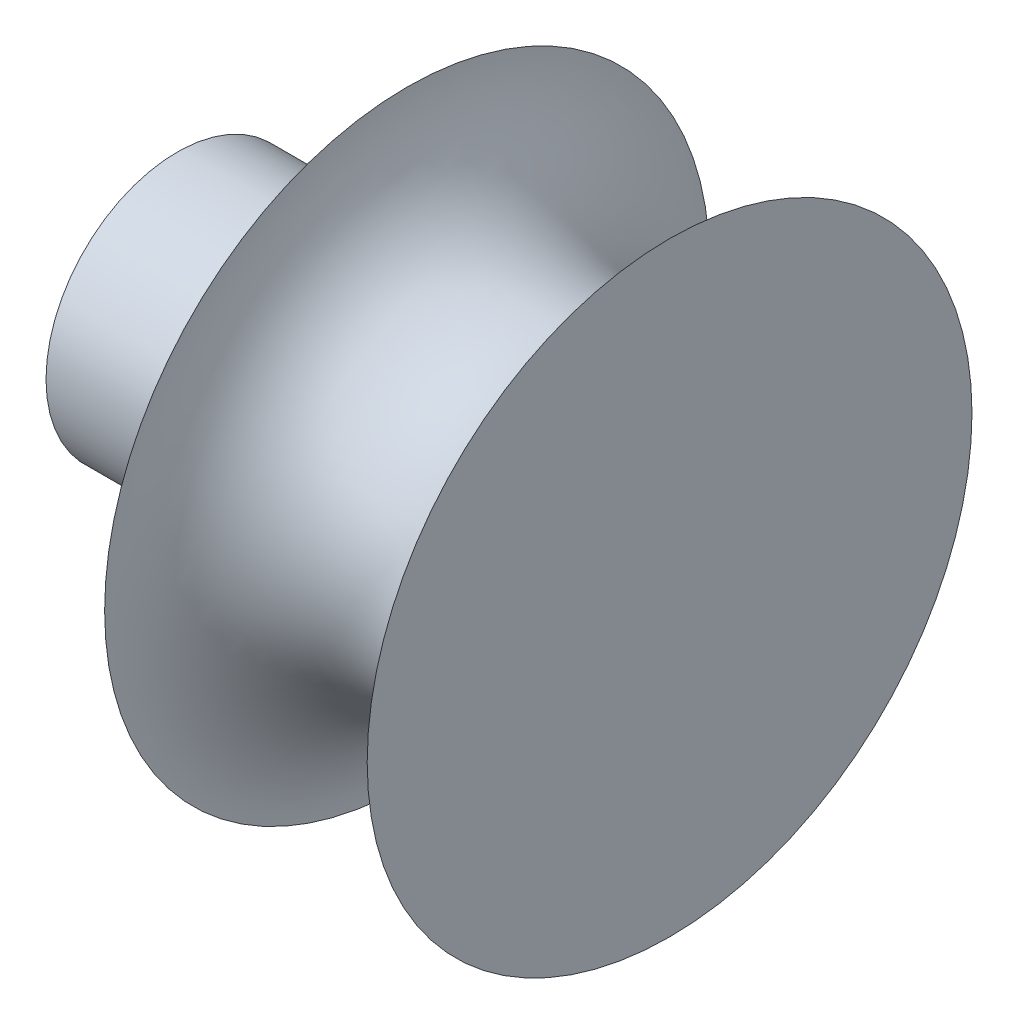
ISO-10303-21;
HEADER;
FILE_DESCRIPTION(('STEP AP214'),'2;1');
FILE_NAME('part.step','',(''),(''),'','','');
FILE_SCHEMA(('AUTOMOTIVE_DESIGN { 1 0 10303 214 1 1 1 1 }'));
ENDSEC;
DATA;
#1=APPLICATION_CONTEXT('core data for automotive mechanical design processes');
#2=APPLICATION_PROTOCOL_DEFINITION('international standard','automotive_design',2000,#1);
#3=PRODUCT_CONTEXT('',#1,'mechanical');
#4=PRODUCT('Part','Part','',(#3));
#5=PRODUCT_RELATED_PRODUCT_CATEGORY('part','',(#4));
#6=PRODUCT_DEFINITION_FORMATION('','',#4);
#7=PRODUCT_DEFINITION_CONTEXT('part definition',#1,'design');
#8=PRODUCT_DEFINITION('design','',#6,#7);
#9=PRODUCT_DEFINITION_SHAPE('','',#8);
#10=(LENGTH_UNIT() NAMED_UNIT(*) SI_UNIT(.MILLI.,.METRE.));
#11=(NAMED_UNIT(*) PLANE_ANGLE_UNIT() SI_UNIT($,.RADIAN.));
#12=(NAMED_UNIT(*) SI_UNIT($,.STERADIAN.) SOLID_ANGLE_UNIT());
#13=UNCERTAINTY_MEASURE_WITH_UNIT(LENGTH_MEASURE(1.E-05),#10,'distance_accuracy_value','');
#14=(GEOMETRIC_REPRESENTATION_CONTEXT(3) GLOBAL_UNCERTAINTY_ASSIGNED_CONTEXT((#13)) GLOBAL_UNIT_ASSIGNED_CONTEXT((#10,
#11,#12)) REPRESENTATION_CONTEXT('',''));
#15=CARTESIAN_POINT('',(0.,0.,0.));
#16=DIRECTION('',(0.,0.,1.));
#17=DIRECTION('',(1.,0.,0.));
#18=AXIS2_PLACEMENT_3D('',#15,#16,#17);
#19=CARTESIAN_POINT('',(0.,0.,0.));
#20=DIRECTION('',(1.,0.,0.));
#21=DIRECTION('',(0.,0.,-1.));
#22=AXIS2_PLACEMENT_3D('',#19,#20,#21);
#23=PLANE('',#22);
#24=CARTESIAN_POINT('',(0.,0.,0.));
#25=DIRECTION('',(-1.,0.,0.));
#26=DIRECTION('',(0.,0.,1.));
#27=AXIS2_PLACEMENT_3D('',#24,#25,#26);
#28=CIRCLE('',#27,4.);
#29=CARTESIAN_POINT('',(0.,0.,4.));
#30=VERTEX_POINT('',#29);
#31=EDGE_CURVE('E57',#30,#30,#28,.T.);
#32=ORIENTED_EDGE('',*,*,#31,.T.);
#33=EDGE_LOOP('',(#32));
#34=FACE_BOUND('',#33,.T.);
#35=ADVANCED_FACE('F40',(#34),#23,.F.);
#36=CARTESIAN_POINT('',(15.,0.,0.));
#37=DIRECTION('',(-1.,0.,0.));
#38=DIRECTION('',(0.,0.,1.));
#39=AXIS2_PLACEMENT_3D('',#36,#37,#38);
#40=PLANE('',#39);
#41=CARTESIAN_POINT('',(15.,0.,0.));
#42=DIRECTION('',(-1.,0.,0.));
#43=DIRECTION('',(0.,0.,1.));
#44=AXIS2_PLACEMENT_3D('',#41,#42,#43);
#45=CIRCLE('',#44,9.21428571428572);
#46=CARTESIAN_POINT('',(15.,0.,9.21428571428572));
#47=VERTEX_POINT('',#46);
#48=EDGE_CURVE('E10',#47,#47,#45,.T.);
#49=ORIENTED_EDGE('',*,*,#48,.F.);
#50=EDGE_LOOP('',(#49));
#51=FACE_BOUND('',#50,.T.);
#52=ADVANCED_FACE('F78',(#51),#40,.F.);
#53=CARTESIAN_POINT('',(11.,0.,0.));
#54=DIRECTION('',(-1.,0.,0.));
#55=DIRECTION('',(0.,0.,1.));
#56=AXIS2_PLACEMENT_3D('',#53,#54,#55);
#57=TOROIDAL_SURFACE('',#56,9.21428571428572,4.);
#58=CARTESIAN_POINT('',(7.,0.,0.));
#59=DIRECTION('',(-1.,0.,0.));
#60=DIRECTION('',(0.,0.,1.));
#61=AXIS2_PLACEMENT_3D('',#58,#59,#60);
#62=CIRCLE('',#61,9.21428571428572);
#63=CARTESIAN_POINT('',(7.,0.,9.21428571428572));
#64=VERTEX_POINT('',#63);
#65=EDGE_CURVE('E47',#64,#64,#62,.T.);
#66=ORIENTED_EDGE('',*,*,#65,.F.);
#67=EDGE_LOOP('',(#66));
#68=FACE_BOUND('',#67,.T.);
#69=ORIENTED_EDGE('',*,*,#48,.T.);
#70=EDGE_LOOP('',(#69));
#71=FACE_BOUND('',#70,.T.);
#72=ADVANCED_FACE('F73',(#68,#71),#57,.F.);
#73=CARTESIAN_POINT('',(7.,9.21428571428572,0.));
#74=DIRECTION('',(1.,0.,0.));
#75=DIRECTION('',(0.,0.,-1.));
#76=AXIS2_PLACEMENT_3D('',#73,#74,#75);
#77=PLANE('',#76);
#78=CARTESIAN_POINT('',(7.,0.,0.));
#79=DIRECTION('',(-1.,0.,0.));
#80=DIRECTION('',(0.,0.,1.));
#81=AXIS2_PLACEMENT_3D('',#78,#79,#80);
#82=CIRCLE('',#81,4.);
#83=CARTESIAN_POINT('',(7.,0.,4.));
#84=VERTEX_POINT('',#83);
#85=EDGE_CURVE('E52',#84,#84,#82,.T.);
#86=ORIENTED_EDGE('',*,*,#85,.F.);
#87=EDGE_LOOP('',(#86));
#88=FACE_BOUND('',#87,.T.);
#89=ORIENTED_EDGE('',*,*,#65,.T.);
#90=EDGE_LOOP('',(#89));
#91=FACE_BOUND('',#90,.T.);
#92=ADVANCED_FACE('F68',(#88,#91),#77,.F.);
#93=CARTESIAN_POINT('',(0.,0.,0.));
#94=DIRECTION('',(-1.,0.,0.));
#95=DIRECTION('',(0.,0.,1.));
#96=AXIS2_PLACEMENT_3D('',#93,#94,#95);
#97=CYLINDRICAL_SURFACE('',#96,4.);
#98=ORIENTED_EDGE('',*,*,#31,.F.);
#99=EDGE_LOOP('',(#98));
#100=FACE_BOUND('',#99,.T.);
#101=ORIENTED_EDGE('',*,*,#85,.T.);
#102=EDGE_LOOP('',(#101));
#103=FACE_BOUND('',#102,.T.);
#104=ADVANCED_FACE('F65',(#100,#103),#97,.T.);
#105=CLOSED_SHELL('',(#35,#52,#72,#92,#104));
#106=MANIFOLD_SOLID_BREP('B2',#105);
#107=ADVANCED_BREP_SHAPE_REPRESENTATION('',(#18,#106),#14);
#108=SHAPE_DEFINITION_REPRESENTATION(#9,#107);
ENDSEC;
END-ISO-10303-21;
